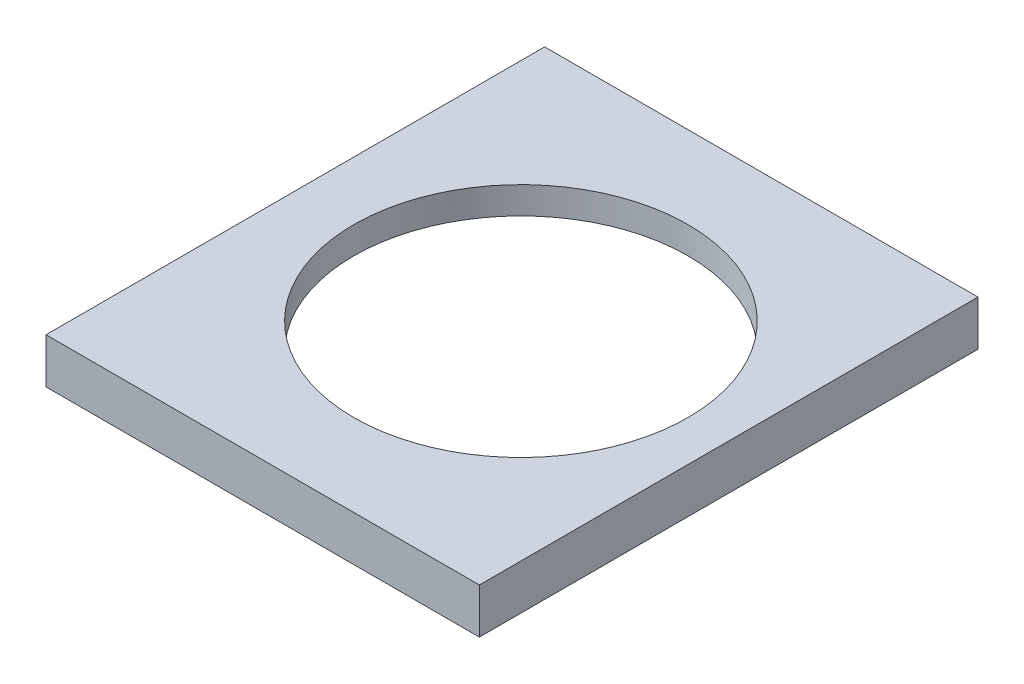
ISO-10303-21;
HEADER;
FILE_DESCRIPTION(('STEP AP214'),'2;1');
FILE_NAME('part.step','',(''),(''),'','','');
FILE_SCHEMA(('AUTOMOTIVE_DESIGN { 1 0 10303 214 1 1 1 1 }'));
ENDSEC;
DATA;
#1=APPLICATION_CONTEXT('core data for automotive mechanical design processes');
#2=APPLICATION_PROTOCOL_DEFINITION('international standard','automotive_design',2000,#1);
#3=PRODUCT_CONTEXT('',#1,'mechanical');
#4=PRODUCT('Part','Part','',(#3));
#5=PRODUCT_RELATED_PRODUCT_CATEGORY('part','',(#4));
#6=PRODUCT_DEFINITION_FORMATION('','',#4);
#7=PRODUCT_DEFINITION_CONTEXT('part definition',#1,'design');
#8=PRODUCT_DEFINITION('design','',#6,#7);
#9=PRODUCT_DEFINITION_SHAPE('','',#8);
#10=(LENGTH_UNIT() NAMED_UNIT(*) SI_UNIT(.MILLI.,.METRE.));
#11=(NAMED_UNIT(*) PLANE_ANGLE_UNIT() SI_UNIT($,.RADIAN.));
#12=(NAMED_UNIT(*) SI_UNIT($,.STERADIAN.) SOLID_ANGLE_UNIT());
#13=UNCERTAINTY_MEASURE_WITH_UNIT(LENGTH_MEASURE(1.E-05),#10,'distance_accuracy_value','');
#14=(GEOMETRIC_REPRESENTATION_CONTEXT(3) GLOBAL_UNCERTAINTY_ASSIGNED_CONTEXT((#13)) GLOBAL_UNIT_ASSIGNED_CONTEXT((#10,
#11,#12)) REPRESENTATION_CONTEXT('',''));
#15=CARTESIAN_POINT('',(0.,0.,0.));
#16=DIRECTION('',(0.,0.,1.));
#17=DIRECTION('',(1.,0.,0.));
#18=AXIS2_PLACEMENT_3D('',#15,#16,#17);
#19=CARTESIAN_POINT('',(0.,0.,0.));
#20=DIRECTION('',(0.,-1.,0.));
#21=DIRECTION('',(0.,0.,-1.));
#22=AXIS2_PLACEMENT_3D('',#19,#20,#21);
#23=PLANE('',#22);
#24=CARTESIAN_POINT('',(18.1159641084399,0.,18.9627617712966));
#25=DIRECTION('',(0.,-1.,0.));
#26=DIRECTION('',(0.,0.,-1.));
#27=AXIS2_PLACEMENT_3D('',#24,#25,#26);
#28=CIRCLE('',#27,2.);
#29=CARTESIAN_POINT('',(18.1159641084399,0.,16.9627617712966));
#30=VERTEX_POINT('',#29);
#31=EDGE_CURVE('E219',#30,#30,#28,.T.);
#32=ORIENTED_EDGE('',*,*,#31,.F.);
#33=EDGE_LOOP('',(#32));
#34=FACE_BOUND('',#33,.T.);
#35=CARTESIAN_POINT('',(-19.3240358915601,0.,-18.4772382287034));
#36=DIRECTION('',(0.,-1.,0.));
#37=DIRECTION('',(0.,0.,-1.));
#38=AXIS2_PLACEMENT_3D('',#35,#36,#37);
#39=CIRCLE('',#38,2.);
#40=CARTESIAN_POINT('',(-19.3240358915601,0.,-20.4772382287034));
#41=VERTEX_POINT('',#40);
#42=EDGE_CURVE('E227',#41,#41,#39,.T.);
#43=ORIENTED_EDGE('',*,*,#42,.F.);
#44=EDGE_LOOP('',(#43));
#45=FACE_BOUND('',#44,.T.);
#46=CARTESIAN_POINT('',(18.1159641084399,0.,-18.4772382287034));
#47=DIRECTION('',(0.,-1.,0.));
#48=DIRECTION('',(0.,0.,-1.));
#49=AXIS2_PLACEMENT_3D('',#46,#47,#48);
#50=CIRCLE('',#49,2.);
#51=CARTESIAN_POINT('',(18.1159641084399,0.,-20.4772382287035));
#52=VERTEX_POINT('',#51);
#53=EDGE_CURVE('E228',#52,#52,#50,.T.);
#54=ORIENTED_EDGE('',*,*,#53,.F.);
#55=EDGE_LOOP('',(#54));
#56=FACE_BOUND('',#55,.T.);
#57=CARTESIAN_POINT('',(-19.3240358915601,0.,18.9627617712966));
#58=DIRECTION('',(0.,-1.,0.));
#59=DIRECTION('',(0.,0.,-1.));
#60=AXIS2_PLACEMENT_3D('',#57,#58,#59);
#61=CIRCLE('',#60,2.);
#62=CARTESIAN_POINT('',(-19.3240358915601,0.,16.9627617712965));
#63=VERTEX_POINT('',#62);
#64=EDGE_CURVE('E215',#63,#63,#61,.T.);
#65=ORIENTED_EDGE('',*,*,#64,.F.);
#66=EDGE_LOOP('',(#65));
#67=FACE_BOUND('',#66,.T.);
#68=CARTESIAN_POINT('',(0.,0.,0.));
#69=DIRECTION('',(0.,-1.,0.));
#70=DIRECTION('',(0.,0.,-1.));
#71=AXIS2_PLACEMENT_3D('',#68,#69,#70);
#72=CIRCLE('',#71,18.5);
#73=CARTESIAN_POINT('',(0.,0.,-18.5));
#74=VERTEX_POINT('',#73);
#75=EDGE_CURVE('E49',#74,#74,#72,.T.);
#76=ORIENTED_EDGE('',*,*,#75,.F.);
#77=EDGE_LOOP('',(#76));
#78=FACE_BOUND('',#77,.T.);
#79=DIRECTION('',(0.,0.,1.));
#80=VECTOR('',#79,1.);
#81=CARTESIAN_POINT('',(21.8,0.,-27.6));
#82=LINE('',#81,#80);
#83=CARTESIAN_POINT('',(21.8,0.,-26.5004389552677));
#84=VERTEX_POINT('',#83);
#85=CARTESIAN_POINT('',(21.8,0.,26.8551971742138));
#86=VERTEX_POINT('',#85);
#87=EDGE_CURVE('E153',#84,#86,#82,.T.);
#88=ORIENTED_EDGE('',*,*,#87,.T.);
#89=DIRECTION('',(1.,0.,0.));
#90=VECTOR('',#89,1.);
#91=CARTESIAN_POINT('',(-24.2654621759078,0.,26.8551971742138));
#92=LINE('',#91,#90);
#93=CARTESIAN_POINT('',(-24.2654621759078,0.,26.8551971742138));
#94=VERTEX_POINT('',#93);
#95=EDGE_CURVE('E124',#94,#86,#92,.T.);
#96=ORIENTED_EDGE('',*,*,#95,.F.);
#97=DIRECTION('',(0.,0.,1.));
#98=VECTOR('',#97,1.);
#99=CARTESIAN_POINT('',(-24.2654621759078,0.,-27.6));
#100=LINE('',#99,#98);
#101=CARTESIAN_POINT('',(-24.2654621759078,0.,-26.5004389552677));
#102=VERTEX_POINT('',#101);
#103=EDGE_CURVE('E132',#102,#94,#100,.T.);
#104=ORIENTED_EDGE('',*,*,#103,.F.);
#105=DIRECTION('',(-1.,0.,0.));
#106=VECTOR('',#105,1.);
#107=CARTESIAN_POINT('',(21.8,0.,-26.5004389552677));
#108=LINE('',#107,#106);
#109=EDGE_CURVE('E202',#84,#102,#108,.T.);
#110=ORIENTED_EDGE('',*,*,#109,.F.);
#111=EDGE_LOOP('',(#88,#96,#104,#110));
#112=FACE_BOUND('',#111,.T.);
#113=ADVANCED_FACE('F45',(#34,#45,#56,#67,#78,#112),#23,.T.);
#114=CARTESIAN_POINT('',(21.8,-2.,-27.6));
#115=DIRECTION('',(-1.,0.,0.));
#116=DIRECTION('',(0.,0.,1.));
#117=AXIS2_PLACEMENT_3D('',#114,#115,#116);
#118=PLANE('',#117);
#119=DIRECTION('',(0.,0.,1.));
#120=VECTOR('',#119,1.);
#121=CARTESIAN_POINT('',(21.8,-2.,-27.6));
#122=LINE('',#121,#120);
#123=CARTESIAN_POINT('',(21.8,-2.,-26.5004389552677));
#124=VERTEX_POINT('',#123);
#125=CARTESIAN_POINT('',(21.8,-2.,26.8551971742138));
#126=VERTEX_POINT('',#125);
#127=EDGE_CURVE('E157',#124,#126,#122,.T.);
#128=ORIENTED_EDGE('',*,*,#127,.T.);
#129=DIRECTION('',(0.,1.,0.));
#130=VECTOR('',#129,1.);
#131=CARTESIAN_POINT('',(21.8,-2.,26.8551971742138));
#132=LINE('',#131,#130);
#133=EDGE_CURVE('E118',#126,#86,#132,.T.);
#134=ORIENTED_EDGE('',*,*,#133,.T.);
#135=ORIENTED_EDGE('',*,*,#87,.F.);
#136=DIRECTION('',(0.,1.,0.));
#137=VECTOR('',#136,1.);
#138=CARTESIAN_POINT('',(21.8,-2.,-26.5004389552677));
#139=LINE('',#138,#137);
#140=EDGE_CURVE('E207',#124,#84,#139,.T.);
#141=ORIENTED_EDGE('',*,*,#140,.F.);
#142=EDGE_LOOP('',(#128,#134,#135,#141));
#143=FACE_BOUND('',#142,.T.);
#144=ADVANCED_FACE('F251',(#143),#118,.T.);
#145=CARTESIAN_POINT('',(-24.2654621759078,-2.,-27.6));
#146=DIRECTION('',(-1.,0.,0.));
#147=DIRECTION('',(0.,0.,1.));
#148=AXIS2_PLACEMENT_3D('',#145,#146,#147);
#149=PLANE('',#148);
#150=DIRECTION('',(0.,1.,0.));
#151=VECTOR('',#150,1.);
#152=CARTESIAN_POINT('',(-24.2654621759078,-2.,26.8551971742138));
#153=LINE('',#152,#151);
#154=CARTESIAN_POINT('',(-24.2654621759078,-2.,26.8551971742138));
#155=VERTEX_POINT('',#154);
#156=EDGE_CURVE('E115',#155,#94,#153,.T.);
#157=ORIENTED_EDGE('',*,*,#156,.F.);
#158=DIRECTION('',(0.,0.,1.));
#159=VECTOR('',#158,1.);
#160=CARTESIAN_POINT('',(-24.2654621759078,-2.,-27.6));
#161=LINE('',#160,#159);
#162=CARTESIAN_POINT('',(-24.2654621759078,-2.,-26.5004389552677));
#163=VERTEX_POINT('',#162);
#164=EDGE_CURVE('E130',#163,#155,#161,.T.);
#165=ORIENTED_EDGE('',*,*,#164,.F.);
#166=DIRECTION('',(0.,1.,0.));
#167=VECTOR('',#166,1.);
#168=CARTESIAN_POINT('',(-24.2654621759078,-2.,-26.5004389552677));
#169=LINE('',#168,#167);
#170=EDGE_CURVE('E62',#163,#102,#169,.T.);
#171=ORIENTED_EDGE('',*,*,#170,.T.);
#172=ORIENTED_EDGE('',*,*,#103,.T.);
#173=EDGE_LOOP('',(#157,#165,#171,#172));
#174=FACE_BOUND('',#173,.T.);
#175=ADVANCED_FACE('F129',(#174),#149,.F.);
#176=CARTESIAN_POINT('',(23.,3.,27.6));
#177=DIRECTION('',(-1.,0.,0.));
#178=DIRECTION('',(0.,0.,1.));
#179=AXIS2_PLACEMENT_3D('',#176,#177,#178);
#180=PLANE('',#179);
#181=DIRECTION('',(0.,-1.,0.));
#182=VECTOR('',#181,1.);
#183=CARTESIAN_POINT('',(23.,3.,27.6));
#184=LINE('',#183,#182);
#185=CARTESIAN_POINT('',(23.,3.,27.6));
#186=VERTEX_POINT('',#185);
#187=CARTESIAN_POINT('',(23.,-2.,27.6));
#188=VERTEX_POINT('',#187);
#189=EDGE_CURVE('E177',#186,#188,#184,.T.);
#190=ORIENTED_EDGE('',*,*,#189,.T.);
#191=DIRECTION('',(0.,0.,-1.));
#192=VECTOR('',#191,1.);
#193=CARTESIAN_POINT('',(23.,-2.,27.6));
#194=LINE('',#193,#192);
#195=CARTESIAN_POINT('',(23.,-2.,-27.6));
#196=VERTEX_POINT('',#195);
#197=EDGE_CURVE('E134',#188,#196,#194,.T.);
#198=ORIENTED_EDGE('',*,*,#197,.T.);
#199=DIRECTION('',(0.,-1.,0.));
#200=VECTOR('',#199,1.);
#201=CARTESIAN_POINT('',(23.,3.,-27.6));
#202=LINE('',#201,#200);
#203=CARTESIAN_POINT('',(23.,3.,-27.6));
#204=VERTEX_POINT('',#203);
#205=EDGE_CURVE('E11',#204,#196,#202,.T.);
#206=ORIENTED_EDGE('',*,*,#205,.F.);
#207=DIRECTION('',(0.,0.,-1.));
#208=VECTOR('',#207,1.);
#209=CARTESIAN_POINT('',(23.,3.,27.6));
#210=LINE('',#209,#208);
#211=EDGE_CURVE('E166',#186,#204,#210,.T.);
#212=ORIENTED_EDGE('',*,*,#211,.F.);
#213=EDGE_LOOP('',(#190,#198,#206,#212));
#214=FACE_BOUND('',#213,.T.);
#215=ADVANCED_FACE('F47',(#214),#180,.F.);
#216=CARTESIAN_POINT('',(-24.9749786137999,3.,-27.6));
#217=DIRECTION('',(0.,0.,1.));
#218=DIRECTION('',(1.,0.,0.));
#219=AXIS2_PLACEMENT_3D('',#216,#217,#218);
#220=PLANE('',#219);
#221=ORIENTED_EDGE('',*,*,#205,.T.);
#222=DIRECTION('',(1.,0.,0.));
#223=VECTOR('',#222,1.);
#224=CARTESIAN_POINT('',(-24.9749786137999,-2.,-27.6));
#225=LINE('',#224,#223);
#226=CARTESIAN_POINT('',(-24.9749786137999,-2.,-27.6));
#227=VERTEX_POINT('',#226);
#228=EDGE_CURVE('E140',#227,#196,#225,.T.);
#229=ORIENTED_EDGE('',*,*,#228,.F.);
#230=DIRECTION('',(0.,-1.,0.));
#231=VECTOR('',#230,1.);
#232=CARTESIAN_POINT('',(-24.9749786137999,3.,-27.6));
#233=LINE('',#232,#231);
#234=CARTESIAN_POINT('',(-24.9749786137999,3.,-27.6));
#235=VERTEX_POINT('',#234);
#236=EDGE_CURVE('E55',#235,#227,#233,.T.);
#237=ORIENTED_EDGE('',*,*,#236,.F.);
#238=DIRECTION('',(-1.,0.,0.));
#239=VECTOR('',#238,1.);
#240=CARTESIAN_POINT('',(-24.9749786137999,3.,-27.6));
#241=LINE('',#240,#239);
#242=EDGE_CURVE('E169',#204,#235,#241,.T.);
#243=ORIENTED_EDGE('',*,*,#242,.F.);
#244=EDGE_LOOP('',(#221,#229,#237,#243));
#245=FACE_BOUND('',#244,.T.);
#246=ADVANCED_FACE('F194',(#245),#220,.F.);
#247=CARTESIAN_POINT('',(-24.9749786137999,3.,27.6));
#248=DIRECTION('',(1.,0.,0.));
#249=DIRECTION('',(0.,0.,-1.));
#250=AXIS2_PLACEMENT_3D('',#247,#248,#249);
#251=PLANE('',#250);
#252=ORIENTED_EDGE('',*,*,#236,.T.);
#253=DIRECTION('',(0.,0.,-1.));
#254=VECTOR('',#253,1.);
#255=CARTESIAN_POINT('',(-24.9749786137999,-2.,27.6));
#256=LINE('',#255,#254);
#257=CARTESIAN_POINT('',(-24.9749786137999,-2.,27.6));
#258=VERTEX_POINT('',#257);
#259=EDGE_CURVE('E147',#258,#227,#256,.T.);
#260=ORIENTED_EDGE('',*,*,#259,.F.);
#261=DIRECTION('',(0.,-1.,0.));
#262=VECTOR('',#261,1.);
#263=CARTESIAN_POINT('',(-24.9749786137999,3.,27.6));
#264=LINE('',#263,#262);
#265=CARTESIAN_POINT('',(-24.9749786137999,3.,27.6));
#266=VERTEX_POINT('',#265);
#267=EDGE_CURVE('E181',#266,#258,#264,.T.);
#268=ORIENTED_EDGE('',*,*,#267,.F.);
#269=DIRECTION('',(0.,0.,1.));
#270=VECTOR('',#269,1.);
#271=CARTESIAN_POINT('',(-24.9749786137999,3.,27.6));
#272=LINE('',#271,#270);
#273=EDGE_CURVE('E172',#235,#266,#272,.T.);
#274=ORIENTED_EDGE('',*,*,#273,.F.);
#275=EDGE_LOOP('',(#252,#260,#268,#274));
#276=FACE_BOUND('',#275,.T.);
#277=ADVANCED_FACE('F190',(#276),#251,.F.);
#278=CARTESIAN_POINT('',(-24.9749786137999,3.,27.6));
#279=DIRECTION('',(0.,0.,-1.));
#280=DIRECTION('',(-1.,0.,0.));
#281=AXIS2_PLACEMENT_3D('',#278,#279,#280);
#282=PLANE('',#281);
#283=ORIENTED_EDGE('',*,*,#267,.T.);
#284=DIRECTION('',(-1.,0.,0.));
#285=VECTOR('',#284,1.);
#286=CARTESIAN_POINT('',(-24.2654621759078,-2.,27.6));
#287=LINE('',#286,#285);
#288=EDGE_CURVE('E139',#188,#258,#287,.T.);
#289=ORIENTED_EDGE('',*,*,#288,.F.);
#290=ORIENTED_EDGE('',*,*,#189,.F.);
#291=DIRECTION('',(1.,0.,0.));
#292=VECTOR('',#291,1.);
#293=CARTESIAN_POINT('',(-24.9749786137999,3.,27.6));
#294=LINE('',#293,#292);
#295=EDGE_CURVE('E70',#266,#186,#294,.T.);
#296=ORIENTED_EDGE('',*,*,#295,.F.);
#297=EDGE_LOOP('',(#283,#289,#290,#296));
#298=FACE_BOUND('',#297,.T.);
#299=ADVANCED_FACE('F285',(#298),#282,.F.);
#300=CARTESIAN_POINT('',(0.,3.,0.));
#301=DIRECTION('',(0.,-1.,0.));
#302=DIRECTION('',(0.,0.,-1.));
#303=AXIS2_PLACEMENT_3D('',#300,#301,#302);
#304=PLANE('',#303);
#305=CARTESIAN_POINT('',(0.,3.,0.));
#306=DIRECTION('',(0.,1.,0.));
#307=DIRECTION('',(0.,0.,1.));
#308=AXIS2_PLACEMENT_3D('',#305,#306,#307);
#309=CIRCLE('',#308,18.5);
#310=CARTESIAN_POINT('',(0.,3.,18.5));
#311=VERTEX_POINT('',#310);
#312=EDGE_CURVE('E145',#311,#311,#309,.T.);
#313=ORIENTED_EDGE('',*,*,#312,.F.);
#314=EDGE_LOOP('',(#313));
#315=FACE_BOUND('',#314,.T.);
#316=ORIENTED_EDGE('',*,*,#211,.T.);
#317=ORIENTED_EDGE('',*,*,#242,.T.);
#318=ORIENTED_EDGE('',*,*,#273,.T.);
#319=ORIENTED_EDGE('',*,*,#295,.T.);
#320=EDGE_LOOP('',(#316,#317,#318,#319));
#321=FACE_BOUND('',#320,.T.);
#322=ADVANCED_FACE('F282',(#315,#321),#304,.F.);
#323=CARTESIAN_POINT('',(0.,-5.,0.));
#324=DIRECTION('',(0.,1.,0.));
#325=DIRECTION('',(0.,0.,1.));
#326=AXIS2_PLACEMENT_3D('',#323,#324,#325);
#327=CYLINDRICAL_SURFACE('',#326,18.5);
#328=ORIENTED_EDGE('',*,*,#75,.T.);
#329=EDGE_LOOP('',(#328));
#330=FACE_BOUND('',#329,.T.);
#331=ORIENTED_EDGE('',*,*,#312,.T.);
#332=EDGE_LOOP('',(#331));
#333=FACE_BOUND('',#332,.T.);
#334=ADVANCED_FACE('F272',(#330,#333),#327,.F.);
#335=CARTESIAN_POINT('',(0.,-2.,0.));
#336=DIRECTION('',(0.,-1.,0.));
#337=DIRECTION('',(0.,0.,-1.));
#338=AXIS2_PLACEMENT_3D('',#335,#336,#337);
#339=PLANE('',#338);
#340=ORIENTED_EDGE('',*,*,#197,.F.);
#341=ORIENTED_EDGE('',*,*,#288,.T.);
#342=ORIENTED_EDGE('',*,*,#259,.T.);
#343=ORIENTED_EDGE('',*,*,#228,.T.);
#344=EDGE_LOOP('',(#340,#341,#342,#343));
#345=FACE_BOUND('',#344,.T.);
#346=DIRECTION('',(1.,0.,0.));
#347=VECTOR('',#346,1.);
#348=CARTESIAN_POINT('',(-24.2654621759078,-2.,26.8551971742138));
#349=LINE('',#348,#347);
#350=EDGE_CURVE('E112',#155,#126,#349,.T.);
#351=ORIENTED_EDGE('',*,*,#350,.T.);
#352=ORIENTED_EDGE('',*,*,#127,.F.);
#353=DIRECTION('',(-1.,0.,0.));
#354=VECTOR('',#353,1.);
#355=CARTESIAN_POINT('',(21.8,-2.,-26.5004389552677));
#356=LINE('',#355,#354);
#357=EDGE_CURVE('E137',#124,#163,#356,.T.);
#358=ORIENTED_EDGE('',*,*,#357,.T.);
#359=ORIENTED_EDGE('',*,*,#164,.T.);
#360=EDGE_LOOP('',(#351,#352,#358,#359));
#361=FACE_BOUND('',#360,.T.);
#362=ADVANCED_FACE('F136',(#345,#361),#339,.T.);
#363=CARTESIAN_POINT('',(21.8,-2.,-26.5004389552677));
#364=DIRECTION('',(0.,0.,-1.));
#365=DIRECTION('',(-1.,0.,0.));
#366=AXIS2_PLACEMENT_3D('',#363,#364,#365);
#367=PLANE('',#366);
#368=ORIENTED_EDGE('',*,*,#109,.T.);
#369=ORIENTED_EDGE('',*,*,#170,.F.);
#370=ORIENTED_EDGE('',*,*,#357,.F.);
#371=ORIENTED_EDGE('',*,*,#140,.T.);
#372=EDGE_LOOP('',(#368,#369,#370,#371));
#373=FACE_BOUND('',#372,.T.);
#374=ADVANCED_FACE('F263',(#373),#367,.F.);
#375=CARTESIAN_POINT('',(-24.2654621759078,-2.,26.8551971742138));
#376=DIRECTION('',(0.,0.,1.));
#377=DIRECTION('',(1.,0.,0.));
#378=AXIS2_PLACEMENT_3D('',#375,#376,#377);
#379=PLANE('',#378);
#380=ORIENTED_EDGE('',*,*,#95,.T.);
#381=ORIENTED_EDGE('',*,*,#133,.F.);
#382=ORIENTED_EDGE('',*,*,#350,.F.);
#383=ORIENTED_EDGE('',*,*,#156,.T.);
#384=EDGE_LOOP('',(#380,#381,#382,#383));
#385=FACE_BOUND('',#384,.T.);
#386=ADVANCED_FACE('F114',(#385),#379,.F.);
#387=CARTESIAN_POINT('',(-19.3240358915601,2.5,18.9627617712966));
#388=DIRECTION('',(0.,-1.,0.));
#389=DIRECTION('',(0.,0.,-1.));
#390=AXIS2_PLACEMENT_3D('',#387,#388,#389);
#391=CYLINDRICAL_SURFACE('',#390,2.);
#392=CARTESIAN_POINT('',(-19.3240358915601,2.5,18.9627617712966));
#393=DIRECTION('',(0.,-1.,0.));
#394=DIRECTION('',(0.,0.,-1.));
#395=AXIS2_PLACEMENT_3D('',#392,#393,#394);
#396=CIRCLE('',#395,2.);
#397=CARTESIAN_POINT('',(-19.3240358915601,2.5,16.9627617712965));
#398=VERTEX_POINT('',#397);
#399=EDGE_CURVE('E209',#398,#398,#396,.T.);
#400=ORIENTED_EDGE('',*,*,#399,.F.);
#401=EDGE_LOOP('',(#400));
#402=FACE_BOUND('',#401,.T.);
#403=ORIENTED_EDGE('',*,*,#64,.T.);
#404=EDGE_LOOP('',(#403));
#405=FACE_BOUND('',#404,.T.);
#406=ADVANCED_FACE('F270',(#402,#405),#391,.F.);
#407=CARTESIAN_POINT('',(-19.3240358915601,2.5,18.9627617712966));
#408=DIRECTION('',(0.,-1.,0.));
#409=DIRECTION('',(0.,0.,-1.));
#410=AXIS2_PLACEMENT_3D('',#407,#408,#409);
#411=PLANE('',#410);
#412=ORIENTED_EDGE('',*,*,#399,.T.);
#413=EDGE_LOOP('',(#412));
#414=FACE_BOUND('',#413,.T.);
#415=ADVANCED_FACE('F370',(#414),#411,.T.);
#416=CARTESIAN_POINT('',(18.1159641084399,2.5,-18.4772382287034));
#417=DIRECTION('',(0.,-1.,0.));
#418=DIRECTION('',(0.,0.,-1.));
#419=AXIS2_PLACEMENT_3D('',#416,#417,#418);
#420=CYLINDRICAL_SURFACE('',#419,2.);
#421=CARTESIAN_POINT('',(18.1159641084399,2.5,-18.4772382287034));
#422=DIRECTION('',(0.,-1.,0.));
#423=DIRECTION('',(0.,0.,-1.));
#424=AXIS2_PLACEMENT_3D('',#421,#422,#423);
#425=CIRCLE('',#424,2.);
#426=CARTESIAN_POINT('',(18.1159641084399,2.5,-20.4772382287035));
#427=VERTEX_POINT('',#426);
#428=EDGE_CURVE('E239',#427,#427,#425,.T.);
#429=ORIENTED_EDGE('',*,*,#428,.F.);
#430=EDGE_LOOP('',(#429));
#431=FACE_BOUND('',#430,.T.);
#432=ORIENTED_EDGE('',*,*,#53,.T.);
#433=EDGE_LOOP('',(#432));
#434=FACE_BOUND('',#433,.T.);
#435=ADVANCED_FACE('F247',(#431,#434),#420,.F.);
#436=CARTESIAN_POINT('',(18.1159641084399,2.5,-18.4772382287034));
#437=DIRECTION('',(0.,-1.,0.));
#438=DIRECTION('',(0.,0.,-1.));
#439=AXIS2_PLACEMENT_3D('',#436,#437,#438);
#440=PLANE('',#439);
#441=ORIENTED_EDGE('',*,*,#428,.T.);
#442=EDGE_LOOP('',(#441));
#443=FACE_BOUND('',#442,.T.);
#444=ADVANCED_FACE('F388',(#443),#440,.T.);
#445=CARTESIAN_POINT('',(-19.3240358915601,2.5,-18.4772382287034));
#446=DIRECTION('',(0.,-1.,0.));
#447=DIRECTION('',(0.,0.,-1.));
#448=AXIS2_PLACEMENT_3D('',#445,#446,#447);
#449=CYLINDRICAL_SURFACE('',#448,2.);
#450=CARTESIAN_POINT('',(-19.3240358915601,2.5,-18.4772382287034));
#451=DIRECTION('',(0.,-1.,0.));
#452=DIRECTION('',(0.,0.,-1.));
#453=AXIS2_PLACEMENT_3D('',#450,#451,#452);
#454=CIRCLE('',#453,2.);
#455=CARTESIAN_POINT('',(-19.3240358915601,2.5,-20.4772382287034));
#456=VERTEX_POINT('',#455);
#457=EDGE_CURVE('E223',#456,#456,#454,.T.);
#458=ORIENTED_EDGE('',*,*,#457,.F.);
#459=EDGE_LOOP('',(#458));
#460=FACE_BOUND('',#459,.T.);
#461=ORIENTED_EDGE('',*,*,#42,.T.);
#462=EDGE_LOOP('',(#461));
#463=FACE_BOUND('',#462,.T.);
#464=ADVANCED_FACE('F398',(#460,#463),#449,.F.);
#465=CARTESIAN_POINT('',(-19.3240358915601,2.5,-18.4772382287034));
#466=DIRECTION('',(0.,-1.,0.));
#467=DIRECTION('',(0.,0.,-1.));
#468=AXIS2_PLACEMENT_3D('',#465,#466,#467);
#469=PLANE('',#468);
#470=ORIENTED_EDGE('',*,*,#457,.T.);
#471=EDGE_LOOP('',(#470));
#472=FACE_BOUND('',#471,.T.);
#473=ADVANCED_FACE('F408',(#472),#469,.T.);
#474=CARTESIAN_POINT('',(18.1159641084399,2.5,18.9627617712966));
#475=DIRECTION('',(0.,-1.,0.));
#476=DIRECTION('',(0.,0.,-1.));
#477=AXIS2_PLACEMENT_3D('',#474,#475,#476);
#478=CYLINDRICAL_SURFACE('',#477,2.);
#479=CARTESIAN_POINT('',(18.1159641084399,2.5,18.9627617712966));
#480=DIRECTION('',(0.,-1.,0.));
#481=DIRECTION('',(0.,0.,-1.));
#482=AXIS2_PLACEMENT_3D('',#479,#480,#481);
#483=CIRCLE('',#482,2.);
#484=CARTESIAN_POINT('',(18.1159641084399,2.5,16.9627617712966));
#485=VERTEX_POINT('',#484);
#486=EDGE_CURVE('E232',#485,#485,#483,.T.);
#487=ORIENTED_EDGE('',*,*,#486,.F.);
#488=EDGE_LOOP('',(#487));
#489=FACE_BOUND('',#488,.T.);
#490=ORIENTED_EDGE('',*,*,#31,.T.);
#491=EDGE_LOOP('',(#490));
#492=FACE_BOUND('',#491,.T.);
#493=ADVANCED_FACE('F418',(#489,#492),#478,.F.);
#494=CARTESIAN_POINT('',(18.1159641084399,2.5,18.9627617712966));
#495=DIRECTION('',(0.,-1.,0.));
#496=DIRECTION('',(0.,0.,-1.));
#497=AXIS2_PLACEMENT_3D('',#494,#495,#496);
#498=PLANE('',#497);
#499=ORIENTED_EDGE('',*,*,#486,.T.);
#500=EDGE_LOOP('',(#499));
#501=FACE_BOUND('',#500,.T.);
#502=ADVANCED_FACE('F428',(#501),#498,.T.);
#503=CLOSED_SHELL('',(#113,#144,#175,#215,#246,#277,#299,#322,#334,#362,#374,#386,#406,#415,
#435,#444,#464,#473,#493,#502));
#504=MANIFOLD_SOLID_BREP('B2',#503);
#505=ADVANCED_BREP_SHAPE_REPRESENTATION('',(#18,#504),#14);
#506=SHAPE_DEFINITION_REPRESENTATION(#9,#505);
ENDSEC;
END-ISO-10303-21;
